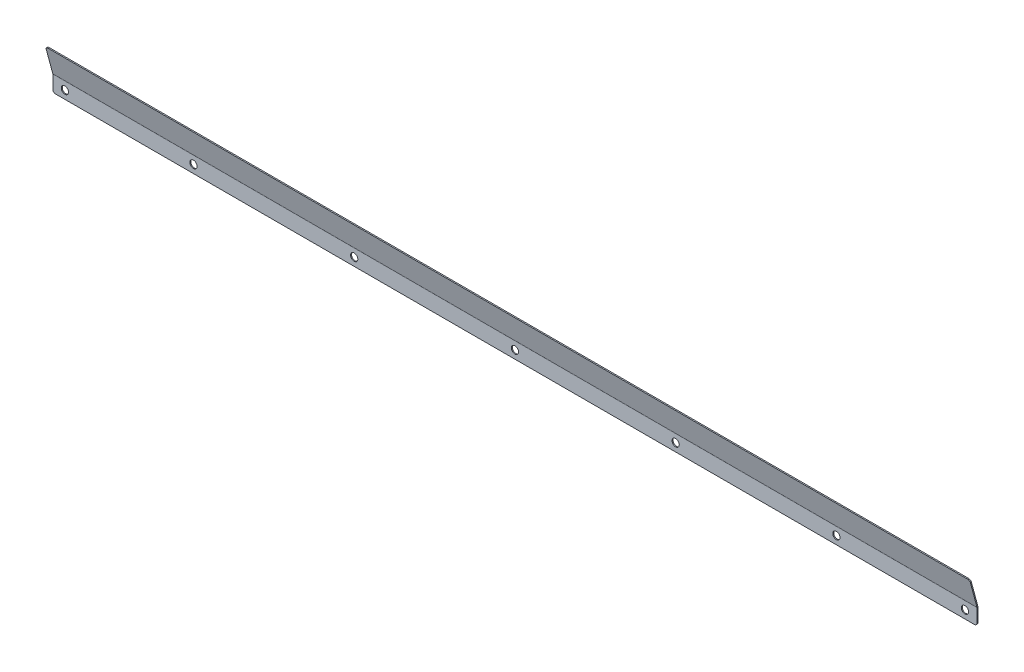
ISO-10303-21;
HEADER;
FILE_DESCRIPTION(('STEP AP214'),'2;1');
FILE_NAME('part.step','',(''),(''),'','','');
FILE_SCHEMA(('AUTOMOTIVE_DESIGN { 1 0 10303 214 1 1 1 1 }'));
ENDSEC;
DATA;
#1=APPLICATION_CONTEXT('core data for automotive mechanical design processes');
#2=APPLICATION_PROTOCOL_DEFINITION('international standard','automotive_design',2000,#1);
#3=PRODUCT_CONTEXT('',#1,'mechanical');
#4=PRODUCT('Part','Part','',(#3));
#5=PRODUCT_RELATED_PRODUCT_CATEGORY('part','',(#4));
#6=PRODUCT_DEFINITION_FORMATION('','',#4);
#7=PRODUCT_DEFINITION_CONTEXT('part definition',#1,'design');
#8=PRODUCT_DEFINITION('design','',#6,#7);
#9=PRODUCT_DEFINITION_SHAPE('','',#8);
#10=(LENGTH_UNIT() NAMED_UNIT(*) SI_UNIT(.MILLI.,.METRE.));
#11=(NAMED_UNIT(*) PLANE_ANGLE_UNIT() SI_UNIT($,.RADIAN.));
#12=(NAMED_UNIT(*) SI_UNIT($,.STERADIAN.) SOLID_ANGLE_UNIT());
#13=UNCERTAINTY_MEASURE_WITH_UNIT(LENGTH_MEASURE(1.E-05),#10,'distance_accuracy_value','');
#14=(GEOMETRIC_REPRESENTATION_CONTEXT(3) GLOBAL_UNCERTAINTY_ASSIGNED_CONTEXT((#13)) GLOBAL_UNIT_ASSIGNED_CONTEXT((#10,
#11,#12)) REPRESENTATION_CONTEXT('',''));
#15=CARTESIAN_POINT('',(0.,0.,0.));
#16=DIRECTION('',(0.,0.,1.));
#17=DIRECTION('',(1.,0.,0.));
#18=AXIS2_PLACEMENT_3D('',#15,#16,#17);
#19=CARTESIAN_POINT('',(0.,0.,0.));
#20=DIRECTION('',(0.,0.,-1.));
#21=DIRECTION('',(-1.,0.,0.));
#22=AXIS2_PLACEMENT_3D('',#19,#20,#21);
#23=PLANE('',#22);
#24=DIRECTION('',(0.,-1.,0.));
#25=VECTOR('',#24,1.);
#26=CARTESIAN_POINT('',(-575.,9.99999999999982,0.));
#27=LINE('',#26,#25);
#28=CARTESIAN_POINT('',(-575.,9.83280132806372,-1.59811400224363E-13));
#29=VERTEX_POINT('',#28);
#30=CARTESIAN_POINT('',(-575.,-8.00000000000006,0.));
#31=VERTEX_POINT('',#30);
#32=EDGE_CURVE('E194',#29,#31,#27,.T.);
#33=ORIENTED_EDGE('',*,*,#32,.T.);
#34=DIRECTION('',(-0.707106781186567,0.707106781186528,0.));
#35=VECTOR('',#34,1.);
#36=CARTESIAN_POINT('',(-575.,-8.00000000000006,0.));
#37=LINE('',#36,#35);
#38=CARTESIAN_POINT('',(-573.,-10.0000000000002,0.));
#39=VERTEX_POINT('',#38);
#40=EDGE_CURVE('E229',#31,#39,#37,.F.);
#41=ORIENTED_EDGE('',*,*,#40,.T.);
#42=DIRECTION('',(1.,0.,0.));
#43=VECTOR('',#42,1.);
#44=CARTESIAN_POINT('',(575.,-9.99999999999982,0.));
#45=LINE('',#44,#43);
#46=CARTESIAN_POINT('',(573.,-9.99999999999982,0.));
#47=VERTEX_POINT('',#46);
#48=EDGE_CURVE('E207',#39,#47,#45,.T.);
#49=ORIENTED_EDGE('',*,*,#48,.T.);
#50=DIRECTION('',(-0.707106781186547,-0.707106781186548,0.));
#51=VECTOR('',#50,1.);
#52=CARTESIAN_POINT('',(573.,-9.99999999999982,0.));
#53=LINE('',#52,#51);
#54=CARTESIAN_POINT('',(575.,-7.99999999999993,0.));
#55=VERTEX_POINT('',#54);
#56=EDGE_CURVE('E227',#47,#55,#53,.F.);
#57=ORIENTED_EDGE('',*,*,#56,.T.);
#58=DIRECTION('',(0.,1.,0.));
#59=VECTOR('',#58,1.);
#60=CARTESIAN_POINT('',(575.,10.0000000000002,0.));
#61=LINE('',#60,#59);
#62=CARTESIAN_POINT('',(575.,9.83280132806372,0.));
#63=VERTEX_POINT('',#62);
#64=EDGE_CURVE('E200',#55,#63,#61,.T.);
#65=ORIENTED_EDGE('',*,*,#64,.T.);
#66=DIRECTION('',(-1.,0.,0.));
#67=VECTOR('',#66,1.);
#68=CARTESIAN_POINT('',(-575.,9.83280132806372,-1.59811400224363E-13));
#69=LINE('',#68,#67);
#70=EDGE_CURVE('E187',#29,#63,#69,.F.);
#71=ORIENTED_EDGE('',*,*,#70,.F.);
#72=EDGE_LOOP('',(#33,#41,#49,#57,#65,#71));
#73=FACE_BOUND('',#72,.T.);
#74=CARTESIAN_POINT('',(-560.,0.,0.));
#75=DIRECTION('',(0.,0.,1.));
#76=DIRECTION('',(1.,0.,0.));
#77=AXIS2_PLACEMENT_3D('',#74,#75,#76);
#78=CIRCLE('',#77,4.49999999999995);
#79=CARTESIAN_POINT('',(-555.5,0.,0.));
#80=VERTEX_POINT('',#79);
#81=EDGE_CURVE('E278',#80,#80,#78,.T.);
#82=ORIENTED_EDGE('',*,*,#81,.F.);
#83=EDGE_LOOP('',(#82));
#84=FACE_BOUND('',#83,.T.);
#85=CARTESIAN_POINT('',(-400.,0.,0.));
#86=DIRECTION('',(0.,0.,1.));
#87=DIRECTION('',(1.,0.,0.));
#88=AXIS2_PLACEMENT_3D('',#85,#86,#87);
#89=CIRCLE('',#88,4.5);
#90=CARTESIAN_POINT('',(-395.5,0.,0.));
#91=VERTEX_POINT('',#90);
#92=EDGE_CURVE('E284',#91,#91,#89,.T.);
#93=ORIENTED_EDGE('',*,*,#92,.F.);
#94=EDGE_LOOP('',(#93));
#95=FACE_BOUND('',#94,.T.);
#96=CARTESIAN_POINT('',(-200.,0.,0.));
#97=DIRECTION('',(0.,0.,1.));
#98=DIRECTION('',(1.,0.,0.));
#99=AXIS2_PLACEMENT_3D('',#96,#97,#98);
#100=CIRCLE('',#99,4.5);
#101=CARTESIAN_POINT('',(-195.5,0.,0.));
#102=VERTEX_POINT('',#101);
#103=EDGE_CURVE('E290',#102,#102,#100,.T.);
#104=ORIENTED_EDGE('',*,*,#103,.F.);
#105=EDGE_LOOP('',(#104));
#106=FACE_BOUND('',#105,.T.);
#107=CARTESIAN_POINT('',(0.,0.,0.));
#108=DIRECTION('',(0.,0.,1.));
#109=DIRECTION('',(1.,0.,0.));
#110=AXIS2_PLACEMENT_3D('',#107,#108,#109);
#111=CIRCLE('',#110,4.5);
#112=CARTESIAN_POINT('',(4.5,0.,0.));
#113=VERTEX_POINT('',#112);
#114=EDGE_CURVE('E296',#113,#113,#111,.T.);
#115=ORIENTED_EDGE('',*,*,#114,.F.);
#116=EDGE_LOOP('',(#115));
#117=FACE_BOUND('',#116,.T.);
#118=CARTESIAN_POINT('',(200.,0.,0.));
#119=DIRECTION('',(0.,0.,1.));
#120=DIRECTION('',(1.,0.,0.));
#121=AXIS2_PLACEMENT_3D('',#118,#119,#120);
#122=CIRCLE('',#121,4.5);
#123=CARTESIAN_POINT('',(204.5,0.,0.));
#124=VERTEX_POINT('',#123);
#125=EDGE_CURVE('E302',#124,#124,#122,.T.);
#126=ORIENTED_EDGE('',*,*,#125,.F.);
#127=EDGE_LOOP('',(#126));
#128=FACE_BOUND('',#127,.T.);
#129=CARTESIAN_POINT('',(400.,0.,0.));
#130=DIRECTION('',(0.,0.,1.));
#131=DIRECTION('',(1.,0.,0.));
#132=AXIS2_PLACEMENT_3D('',#129,#130,#131);
#133=CIRCLE('',#132,4.5);
#134=CARTESIAN_POINT('',(404.5,0.,0.));
#135=VERTEX_POINT('',#134);
#136=EDGE_CURVE('E308',#135,#135,#133,.T.);
#137=ORIENTED_EDGE('',*,*,#136,.F.);
#138=EDGE_LOOP('',(#137));
#139=FACE_BOUND('',#138,.T.);
#140=CARTESIAN_POINT('',(560.,0.,0.));
#141=DIRECTION('',(0.,0.,1.));
#142=DIRECTION('',(1.,0.,0.));
#143=AXIS2_PLACEMENT_3D('',#140,#141,#142);
#144=CIRCLE('',#143,4.49999999999995);
#145=CARTESIAN_POINT('',(564.5,0.,0.));
#146=VERTEX_POINT('',#145);
#147=EDGE_CURVE('E314',#146,#146,#144,.T.);
#148=ORIENTED_EDGE('',*,*,#147,.F.);
#149=EDGE_LOOP('',(#148));
#150=FACE_BOUND('',#149,.T.);
#151=ADVANCED_FACE('F41',(#73,#84,#95,#106,#117,#128,#139,#150),#23,.F.);
#152=CARTESIAN_POINT('',(-575.,9.99999999999982,-1.21412));
#153=DIRECTION('',(-1.,0.,0.));
#154=DIRECTION('',(0.,0.,1.));
#155=AXIS2_PLACEMENT_3D('',#152,#153,#154);
#156=PLANE('',#155);
#157=DIRECTION('',(0.,-1.,0.));
#158=VECTOR('',#157,1.);
#159=CARTESIAN_POINT('',(-575.,9.99999999999982,-1.21412));
#160=LINE('',#159,#158);
#161=CARTESIAN_POINT('',(-575.,9.83280132806356,-1.21412000000016));
#162=VERTEX_POINT('',#161);
#163=CARTESIAN_POINT('',(-575.,-8.00000000000006,-1.21412));
#164=VERTEX_POINT('',#163);
#165=EDGE_CURVE('E196',#162,#164,#160,.T.);
#166=ORIENTED_EDGE('',*,*,#165,.T.);
#167=DIRECTION('',(0.,0.,1.));
#168=VECTOR('',#167,1.);
#169=CARTESIAN_POINT('',(-575.,-8.00000000000006,-1.21412));
#170=LINE('',#169,#168);
#171=EDGE_CURVE('E224',#164,#31,#170,.T.);
#172=ORIENTED_EDGE('',*,*,#171,.T.);
#173=ORIENTED_EDGE('',*,*,#32,.F.);
#174=DIRECTION('',(0.,-1.39324247676828E-13,-1.));
#175=VECTOR('',#174,1.);
#176=CARTESIAN_POINT('',(-575.,9.83280132806372,-1.59811400224363E-13));
#177=LINE('',#176,#175);
#178=EDGE_CURVE('E183',#29,#162,#177,.T.);
#179=ORIENTED_EDGE('',*,*,#178,.T.);
#180=EDGE_LOOP('',(#166,#172,#173,#179));
#181=FACE_BOUND('',#180,.T.);
#182=ADVANCED_FACE('F245',(#181),#156,.T.);
#183=CARTESIAN_POINT('',(0.,0.,-1.21412));
#184=DIRECTION('',(0.,0.,-1.));
#185=DIRECTION('',(-1.,0.,0.));
#186=AXIS2_PLACEMENT_3D('',#183,#184,#185);
#187=PLANE('',#186);
#188=CARTESIAN_POINT('',(560.,0.,-1.21412));
#189=DIRECTION('',(0.,0.,-1.));
#190=DIRECTION('',(-1.,0.,0.));
#191=AXIS2_PLACEMENT_3D('',#188,#189,#190);
#192=CIRCLE('',#191,4.49999999999995);
#193=CARTESIAN_POINT('',(555.5,0.,-1.21412));
#194=VERTEX_POINT('',#193);
#195=EDGE_CURVE('E311',#194,#194,#192,.T.);
#196=ORIENTED_EDGE('',*,*,#195,.F.);
#197=EDGE_LOOP('',(#196));
#198=FACE_BOUND('',#197,.T.);
#199=CARTESIAN_POINT('',(400.,0.,-1.21412));
#200=DIRECTION('',(0.,0.,-1.));
#201=DIRECTION('',(-1.,0.,0.));
#202=AXIS2_PLACEMENT_3D('',#199,#200,#201);
#203=CIRCLE('',#202,4.5);
#204=CARTESIAN_POINT('',(395.5,0.,-1.21412));
#205=VERTEX_POINT('',#204);
#206=EDGE_CURVE('E305',#205,#205,#203,.T.);
#207=ORIENTED_EDGE('',*,*,#206,.F.);
#208=EDGE_LOOP('',(#207));
#209=FACE_BOUND('',#208,.T.);
#210=CARTESIAN_POINT('',(200.,0.,-1.21412));
#211=DIRECTION('',(0.,0.,-1.));
#212=DIRECTION('',(-1.,0.,0.));
#213=AXIS2_PLACEMENT_3D('',#210,#211,#212);
#214=CIRCLE('',#213,4.5);
#215=CARTESIAN_POINT('',(195.5,0.,-1.21412));
#216=VERTEX_POINT('',#215);
#217=EDGE_CURVE('E299',#216,#216,#214,.T.);
#218=ORIENTED_EDGE('',*,*,#217,.F.);
#219=EDGE_LOOP('',(#218));
#220=FACE_BOUND('',#219,.T.);
#221=CARTESIAN_POINT('',(0.,0.,-1.21412));
#222=DIRECTION('',(0.,0.,-1.));
#223=DIRECTION('',(-1.,0.,0.));
#224=AXIS2_PLACEMENT_3D('',#221,#222,#223);
#225=CIRCLE('',#224,4.5);
#226=CARTESIAN_POINT('',(-4.5,0.,-1.21412));
#227=VERTEX_POINT('',#226);
#228=EDGE_CURVE('E293',#227,#227,#225,.T.);
#229=ORIENTED_EDGE('',*,*,#228,.F.);
#230=EDGE_LOOP('',(#229));
#231=FACE_BOUND('',#230,.T.);
#232=CARTESIAN_POINT('',(-200.,0.,-1.21412));
#233=DIRECTION('',(0.,0.,-1.));
#234=DIRECTION('',(-1.,0.,0.));
#235=AXIS2_PLACEMENT_3D('',#232,#233,#234);
#236=CIRCLE('',#235,4.5);
#237=CARTESIAN_POINT('',(-204.5,0.,-1.21412));
#238=VERTEX_POINT('',#237);
#239=EDGE_CURVE('E287',#238,#238,#236,.T.);
#240=ORIENTED_EDGE('',*,*,#239,.F.);
#241=EDGE_LOOP('',(#240));
#242=FACE_BOUND('',#241,.T.);
#243=CARTESIAN_POINT('',(-400.,0.,-1.21412));
#244=DIRECTION('',(0.,0.,-1.));
#245=DIRECTION('',(-1.,0.,0.));
#246=AXIS2_PLACEMENT_3D('',#243,#244,#245);
#247=CIRCLE('',#246,4.5);
#248=CARTESIAN_POINT('',(-404.5,0.,-1.21412));
#249=VERTEX_POINT('',#248);
#250=EDGE_CURVE('E281',#249,#249,#247,.T.);
#251=ORIENTED_EDGE('',*,*,#250,.F.);
#252=EDGE_LOOP('',(#251));
#253=FACE_BOUND('',#252,.T.);
#254=CARTESIAN_POINT('',(-560.,0.,-1.21412));
#255=DIRECTION('',(0.,0.,-1.));
#256=DIRECTION('',(-1.,0.,0.));
#257=AXIS2_PLACEMENT_3D('',#254,#255,#256);
#258=CIRCLE('',#257,4.49999999999995);
#259=CARTESIAN_POINT('',(-564.5,0.,-1.21412));
#260=VERTEX_POINT('',#259);
#261=EDGE_CURVE('E273',#260,#260,#258,.T.);
#262=ORIENTED_EDGE('',*,*,#261,.F.);
#263=EDGE_LOOP('',(#262));
#264=FACE_BOUND('',#263,.T.);
#265=DIRECTION('',(1.,0.,0.));
#266=VECTOR('',#265,1.);
#267=CARTESIAN_POINT('',(575.,-9.99999999999982,-1.21412));
#268=LINE('',#267,#266);
#269=CARTESIAN_POINT('',(-573.,-10.0000000000002,-1.21412));
#270=VERTEX_POINT('',#269);
#271=CARTESIAN_POINT('',(573.,-9.99999999999982,-1.21412));
#272=VERTEX_POINT('',#271);
#273=EDGE_CURVE('E199',#270,#272,#268,.T.);
#274=ORIENTED_EDGE('',*,*,#273,.F.);
#275=DIRECTION('',(0.707106781186567,-0.707106781186528,0.));
#276=VECTOR('',#275,1.);
#277=CARTESIAN_POINT('',(-291.499999999985,-291.5,-1.21412));
#278=LINE('',#277,#276);
#279=EDGE_CURVE('E237',#270,#164,#278,.F.);
#280=ORIENTED_EDGE('',*,*,#279,.T.);
#281=ORIENTED_EDGE('',*,*,#165,.F.);
#282=DIRECTION('',(-1.,0.,0.));
#283=VECTOR('',#282,1.);
#284=CARTESIAN_POINT('',(-575.,9.83280132806355,-1.21412000000016));
#285=LINE('',#284,#283);
#286=CARTESIAN_POINT('',(575.,9.83280132806372,-1.21412));
#287=VERTEX_POINT('',#286);
#288=EDGE_CURVE('E140',#162,#287,#285,.F.);
#289=ORIENTED_EDGE('',*,*,#288,.T.);
#290=DIRECTION('',(0.,1.,0.));
#291=VECTOR('',#290,1.);
#292=CARTESIAN_POINT('',(575.,10.0000000000002,-1.21412));
#293=LINE('',#292,#291);
#294=CARTESIAN_POINT('',(575.,-7.99999999999993,-1.21412));
#295=VERTEX_POINT('',#294);
#296=EDGE_CURVE('E202',#295,#287,#293,.T.);
#297=ORIENTED_EDGE('',*,*,#296,.F.);
#298=DIRECTION('',(0.707106781186547,0.707106781186548,0.));
#299=VECTOR('',#298,1.);
#300=CARTESIAN_POINT('',(291.5,-291.5,-1.21412));
#301=LINE('',#300,#299);
#302=EDGE_CURVE('E63',#295,#272,#301,.F.);
#303=ORIENTED_EDGE('',*,*,#302,.T.);
#304=EDGE_LOOP('',(#274,#280,#281,#289,#297,#303));
#305=FACE_BOUND('',#304,.T.);
#306=ADVANCED_FACE('F240',(#198,#209,#220,#231,#242,#253,#264,#305),#187,.T.);
#307=CARTESIAN_POINT('',(575.,10.0000000000002,-1.21412));
#308=DIRECTION('',(1.,0.,0.));
#309=DIRECTION('',(0.,0.,-1.));
#310=AXIS2_PLACEMENT_3D('',#307,#308,#309);
#311=PLANE('',#310);
#312=ORIENTED_EDGE('',*,*,#64,.F.);
#313=DIRECTION('',(0.,0.,-1.));
#314=VECTOR('',#313,1.);
#315=CARTESIAN_POINT('',(575.,-7.99999999999993,-1.21412));
#316=LINE('',#315,#314);
#317=EDGE_CURVE('E50',#55,#295,#316,.T.);
#318=ORIENTED_EDGE('',*,*,#317,.T.);
#319=ORIENTED_EDGE('',*,*,#296,.T.);
#320=DIRECTION('',(0.,-1.39324247676828E-13,-1.));
#321=VECTOR('',#320,1.);
#322=CARTESIAN_POINT('',(575.,9.83280132806372,0.));
#323=LINE('',#322,#321);
#324=EDGE_CURVE('E191',#63,#287,#323,.T.);
#325=ORIENTED_EDGE('',*,*,#324,.F.);
#326=EDGE_LOOP('',(#312,#318,#319,#325));
#327=FACE_BOUND('',#326,.T.);
#328=ADVANCED_FACE('F258',(#327),#311,.T.);
#329=CARTESIAN_POINT('',(575.,-9.99999999999982,-1.21412));
#330=DIRECTION('',(0.,-1.,0.));
#331=DIRECTION('',(1.,0.,0.));
#332=AXIS2_PLACEMENT_3D('',#329,#330,#331);
#333=PLANE('',#332);
#334=ORIENTED_EDGE('',*,*,#48,.F.);
#335=DIRECTION('',(0.,0.,-1.));
#336=VECTOR('',#335,1.);
#337=CARTESIAN_POINT('',(-573.,-10.0000000000002,-1.21412));
#338=LINE('',#337,#336);
#339=EDGE_CURVE('E234',#39,#270,#338,.T.);
#340=ORIENTED_EDGE('',*,*,#339,.T.);
#341=ORIENTED_EDGE('',*,*,#273,.T.);
#342=DIRECTION('',(0.,0.,1.));
#343=VECTOR('',#342,1.);
#344=CARTESIAN_POINT('',(573.,-9.99999999999982,-1.21412));
#345=LINE('',#344,#343);
#346=EDGE_CURVE('E231',#272,#47,#345,.T.);
#347=ORIENTED_EDGE('',*,*,#346,.T.);
#348=EDGE_LOOP('',(#334,#340,#341,#347));
#349=FACE_BOUND('',#348,.T.);
#350=ADVANCED_FACE('F253',(#349),#333,.T.);
#351=CARTESIAN_POINT('',(575.,9.8328013280639,1.27000000000039));
#352=DIRECTION('',(1.,0.,0.));
#353=DIRECTION('',(0.,0.,-1.));
#354=AXIS2_PLACEMENT_3D('',#351,#352,#353);
#355=PLANE('',#354);
#356=DIRECTION('',(0.,0.258819045102515,-0.96592582628907));
#357=VECTOR('',#356,1.);
#358=CARTESIAN_POINT('',(575.,10.1615015153444,0.0432742006128812));
#359=LINE('',#358,#357);
#360=CARTESIAN_POINT('',(575.,10.1615015153442,0.0432742006128348));
#361=VERTEX_POINT('',#360);
#362=CARTESIAN_POINT('',(575.,10.4757388943841,-1.12947566360125));
#363=VERTEX_POINT('',#362);
#364=EDGE_CURVE('E264',#361,#363,#359,.T.);
#365=ORIENTED_EDGE('',*,*,#364,.F.);
#366=CARTESIAN_POINT('',(575.,9.8328013280639,1.27000000000039));
#367=DIRECTION('',(-1.,0.,0.));
#368=DIRECTION('',(0.,0.,1.));
#369=AXIS2_PLACEMENT_3D('',#366,#367,#368);
#370=CIRCLE('',#369,1.27000000000045);
#371=EDGE_CURVE('E143',#63,#361,#370,.F.);
#372=ORIENTED_EDGE('',*,*,#371,.F.);
#373=ORIENTED_EDGE('',*,*,#324,.T.);
#374=CARTESIAN_POINT('',(575.,9.8328013280639,1.27000000000039));
#375=DIRECTION('',(-1.,0.,0.));
#376=DIRECTION('',(0.,0.,1.));
#377=AXIS2_PLACEMENT_3D('',#374,#375,#376);
#378=CIRCLE('',#377,2.48412000000045);
#379=EDGE_CURVE('E182',#287,#363,#378,.F.);
#380=ORIENTED_EDGE('',*,*,#379,.T.);
#381=EDGE_LOOP('',(#365,#372,#373,#380));
#382=FACE_BOUND('',#381,.T.);
#383=ADVANCED_FACE('F262',(#382),#355,.T.);
#384=CARTESIAN_POINT('',(-575.,9.8328013280639,1.27000000000029));
#385=DIRECTION('',(1.,0.,0.));
#386=DIRECTION('',(0.,0.,-1.));
#387=AXIS2_PLACEMENT_3D('',#384,#385,#386);
#388=PLANE('',#387);
#389=CARTESIAN_POINT('',(-575.,9.8328013280639,1.27000000000029));
#390=DIRECTION('',(-1.,0.,0.));
#391=DIRECTION('',(0.,0.,1.));
#392=AXIS2_PLACEMENT_3D('',#389,#390,#391);
#393=CIRCLE('',#392,1.27000000000045);
#394=CARTESIAN_POINT('',(-575.,10.1615015153442,0.0432742006127368));
#395=VERTEX_POINT('',#394);
#396=EDGE_CURVE('E150',#395,#29,#393,.T.);
#397=ORIENTED_EDGE('',*,*,#396,.F.);
#398=DIRECTION('',(0.,0.258819045102515,-0.96592582628907));
#399=VECTOR('',#398,1.);
#400=CARTESIAN_POINT('',(-575.,10.161501515344,0.0432742006128721));
#401=LINE('',#400,#399);
#402=CARTESIAN_POINT('',(-575.,10.4757388943839,-1.12947566360126));
#403=VERTEX_POINT('',#402);
#404=EDGE_CURVE('E147',#395,#403,#401,.T.);
#405=ORIENTED_EDGE('',*,*,#404,.T.);
#406=CARTESIAN_POINT('',(-575.,9.8328013280639,1.27000000000029));
#407=DIRECTION('',(-1.,0.,0.));
#408=DIRECTION('',(0.,0.,1.));
#409=AXIS2_PLACEMENT_3D('',#406,#407,#408);
#410=CIRCLE('',#409,2.48412000000045);
#411=EDGE_CURVE('E132',#403,#162,#410,.T.);
#412=ORIENTED_EDGE('',*,*,#411,.T.);
#413=ORIENTED_EDGE('',*,*,#178,.F.);
#414=EDGE_LOOP('',(#397,#405,#412,#413));
#415=FACE_BOUND('',#414,.T.);
#416=ADVANCED_FACE('F148',(#415),#388,.F.);
#417=CARTESIAN_POINT('',(-575.,9.8328013280639,1.27000000000029));
#418=DIRECTION('',(-1.,0.,0.));
#419=DIRECTION('',(0.,0.258819045102515,-0.96592582628907));
#420=AXIS2_PLACEMENT_3D('',#417,#418,#419);
#421=CYLINDRICAL_SURFACE('',#420,2.48412000000045);
#422=ORIENTED_EDGE('',*,*,#288,.F.);
#423=ORIENTED_EDGE('',*,*,#411,.F.);
#424=DIRECTION('',(1.,0.,0.));
#425=VECTOR('',#424,1.);
#426=CARTESIAN_POINT('',(0.,10.4757388943841,-1.12947566360121));
#427=LINE('',#426,#425);
#428=EDGE_CURVE('E137',#403,#363,#427,.T.);
#429=ORIENTED_EDGE('',*,*,#428,.T.);
#430=ORIENTED_EDGE('',*,*,#379,.F.);
#431=EDGE_LOOP('',(#422,#423,#429,#430));
#432=FACE_BOUND('',#431,.T.);
#433=ADVANCED_FACE('F134',(#432),#421,.T.);
#434=CARTESIAN_POINT('',(-575.,9.8328013280639,1.27000000000029));
#435=DIRECTION('',(-1.,0.,0.));
#436=DIRECTION('',(0.,0.258819045102515,-0.96592582628907));
#437=AXIS2_PLACEMENT_3D('',#434,#435,#436);
#438=CYLINDRICAL_SURFACE('',#437,1.27000000000045);
#439=ORIENTED_EDGE('',*,*,#70,.T.);
#440=ORIENTED_EDGE('',*,*,#371,.T.);
#441=DIRECTION('',(-1.,0.,0.));
#442=VECTOR('',#441,1.);
#443=CARTESIAN_POINT('',(575.,10.1615015153444,0.0432742006128812));
#444=LINE('',#443,#442);
#445=EDGE_CURVE('E155',#361,#395,#444,.T.);
#446=ORIENTED_EDGE('',*,*,#445,.T.);
#447=ORIENTED_EDGE('',*,*,#396,.T.);
#448=EDGE_LOOP('',(#439,#440,#446,#447));
#449=FACE_BOUND('',#448,.T.);
#450=ADVANCED_FACE('F267',(#449),#438,.F.);
#451=CARTESIAN_POINT('',(575.,10.31423737904,-1.17274986421409));
#452=DIRECTION('',(-1.,0.,0.));
#453=DIRECTION('',(0.,0.,1.));
#454=AXIS2_PLACEMENT_3D('',#451,#452,#453);
#455=PLANE('',#454);
#456=DIRECTION('',(0.,-0.96592582628907,-0.258819045102515));
#457=VECTOR('',#456,1.);
#458=CARTESIAN_POINT('',(575.,10.31423737904,-1.17274986421409));
#459=LINE('',#458,#457);
#460=CARTESIAN_POINT('',(575.,42.0353941979102,7.32690848838295));
#461=VERTEX_POINT('',#460);
#462=EDGE_CURVE('E163',#461,#363,#459,.T.);
#463=ORIENTED_EDGE('',*,*,#462,.F.);
#464=DIRECTION('',(0.,-0.258819045102515,0.96592582628907));
#465=VECTOR('',#464,1.);
#466=CARTESIAN_POINT('',(575.,42.0353941979102,7.32690848838295));
#467=LINE('',#466,#465);
#468=CARTESIAN_POINT('',(575.,41.7211568188703,8.49965835259704));
#469=VERTEX_POINT('',#468);
#470=EDGE_CURVE('E11',#461,#469,#467,.T.);
#471=ORIENTED_EDGE('',*,*,#470,.T.);
#472=DIRECTION('',(0.,-0.96592582628907,-0.258819045102515));
#473=VECTOR('',#472,1.);
#474=CARTESIAN_POINT('',(575.,10.0000000000002,0.));
#475=LINE('',#474,#473);
#476=EDGE_CURVE('E164',#469,#361,#475,.T.);
#477=ORIENTED_EDGE('',*,*,#476,.T.);
#478=ORIENTED_EDGE('',*,*,#364,.T.);
#479=EDGE_LOOP('',(#463,#471,#477,#478));
#480=FACE_BOUND('',#479,.T.);
#481=ADVANCED_FACE('F360',(#480),#455,.F.);
#482=CARTESIAN_POINT('',(-575.,43.9672458504881,7.84454657858801));
#483=DIRECTION('',(1.,0.,0.));
#484=DIRECTION('',(0.,1.,0.));
#485=AXIS2_PLACEMENT_3D('',#482,#483,#484);
#486=PLANE('',#485);
#487=DIRECTION('',(0.,0.96592582628907,0.258819045102515));
#488=VECTOR('',#487,1.);
#489=CARTESIAN_POINT('',(-575.,43.6530084714482,9.0172964428021));
#490=LINE('',#489,#488);
#491=CARTESIAN_POINT('',(-575.,41.7211568188702,8.4996583525971));
#492=VERTEX_POINT('',#491);
#493=EDGE_CURVE('E177',#395,#492,#490,.T.);
#494=ORIENTED_EDGE('',*,*,#493,.T.);
#495=DIRECTION('',(0.,0.258819045102515,-0.96592582628907));
#496=VECTOR('',#495,1.);
#497=CARTESIAN_POINT('',(-575.,42.03539419791,7.32690848838301));
#498=LINE('',#497,#496);
#499=CARTESIAN_POINT('',(-575.,42.03539419791,7.32690848838301));
#500=VERTEX_POINT('',#499);
#501=EDGE_CURVE('E168',#492,#500,#498,.T.);
#502=ORIENTED_EDGE('',*,*,#501,.T.);
#503=DIRECTION('',(0.,0.96592582628907,0.258819045102515));
#504=VECTOR('',#503,1.);
#505=CARTESIAN_POINT('',(-575.,43.9672458504881,7.84454657858801));
#506=LINE('',#505,#504);
#507=EDGE_CURVE('E160',#403,#500,#506,.T.);
#508=ORIENTED_EDGE('',*,*,#507,.F.);
#509=ORIENTED_EDGE('',*,*,#404,.F.);
#510=EDGE_LOOP('',(#494,#502,#508,#509));
#511=FACE_BOUND('',#510,.T.);
#512=ADVANCED_FACE('F166',(#511),#486,.F.);
#513=CARTESIAN_POINT('',(0.,0.98411036011764,-3.67274986421403));
#514=DIRECTION('',(0.,-0.258819045102515,0.96592582628907));
#515=DIRECTION('',(0.,-0.96592582628907,-0.258819045102515));
#516=AXIS2_PLACEMENT_3D('',#513,#514,#515);
#517=PLANE('',#516);
#518=ORIENTED_EDGE('',*,*,#507,.T.);
#519=DIRECTION('',(-0.707106781186547,-0.683012701892221,-0.183012701892215));
#520=VECTOR('',#519,1.);
#521=CARTESIAN_POINT('',(-573.,43.9672458504881,7.84454657858801));
#522=LINE('',#521,#520);
#523=CARTESIAN_POINT('',(-573.,43.9672458504881,7.84454657858801));
#524=VERTEX_POINT('',#523);
#525=EDGE_CURVE('E222',#500,#524,#522,.F.);
#526=ORIENTED_EDGE('',*,*,#525,.T.);
#527=DIRECTION('',(1.,0.,0.));
#528=VECTOR('',#527,1.);
#529=CARTESIAN_POINT('',(575.,43.9672458504884,7.84454657858801));
#530=LINE('',#529,#528);
#531=CARTESIAN_POINT('',(573.,43.9672458504884,7.84454657858801));
#532=VERTEX_POINT('',#531);
#533=EDGE_CURVE('E169',#524,#532,#530,.T.);
#534=ORIENTED_EDGE('',*,*,#533,.T.);
#535=DIRECTION('',(-0.707106781186547,0.683012701892221,0.183012701892215));
#536=VECTOR('',#535,1.);
#537=CARTESIAN_POINT('',(575.,42.0353941979102,7.32690848838295));
#538=LINE('',#537,#536);
#539=EDGE_CURVE('E220',#532,#461,#538,.F.);
#540=ORIENTED_EDGE('',*,*,#539,.T.);
#541=ORIENTED_EDGE('',*,*,#462,.T.);
#542=ORIENTED_EDGE('',*,*,#428,.F.);
#543=EDGE_LOOP('',(#518,#526,#534,#540,#541,#542));
#544=FACE_BOUND('',#543,.T.);
#545=ADVANCED_FACE('F159',(#544),#517,.F.);
#546=CARTESIAN_POINT('',(0.,0.669872981077775,-2.49999999999994));
#547=DIRECTION('',(0.,-0.258819045102515,0.96592582628907));
#548=DIRECTION('',(0.,-0.96592582628907,-0.258819045102515));
#549=AXIS2_PLACEMENT_3D('',#546,#547,#548);
#550=PLANE('',#549);
#551=DIRECTION('',(1.,0.,0.));
#552=VECTOR('',#551,1.);
#553=CARTESIAN_POINT('',(575.,43.6530084714486,9.0172964428021));
#554=LINE('',#553,#552);
#555=CARTESIAN_POINT('',(-573.,43.6530084714482,9.0172964428021));
#556=VERTEX_POINT('',#555);
#557=CARTESIAN_POINT('',(573.,43.6530084714486,9.0172964428021));
#558=VERTEX_POINT('',#557);
#559=EDGE_CURVE('E173',#556,#558,#554,.T.);
#560=ORIENTED_EDGE('',*,*,#559,.F.);
#561=DIRECTION('',(0.707106781186547,0.683012701892221,0.183012701892215));
#562=VECTOR('',#561,1.);
#563=CARTESIAN_POINT('',(-308.749708166261,298.899189958082,77.4103046432715));
#564=LINE('',#563,#562);
#565=EDGE_CURVE('E217',#556,#492,#564,.F.);
#566=ORIENTED_EDGE('',*,*,#565,.T.);
#567=ORIENTED_EDGE('',*,*,#493,.F.);
#568=ORIENTED_EDGE('',*,*,#445,.F.);
#569=ORIENTED_EDGE('',*,*,#476,.F.);
#570=DIRECTION('',(0.707106781186547,-0.683012701892221,-0.183012701892215));
#571=VECTOR('',#570,1.);
#572=CARTESIAN_POINT('',(308.749708166261,298.899189958082,77.4103046432714));
#573=LINE('',#572,#571);
#574=EDGE_CURVE('E215',#469,#558,#573,.F.);
#575=ORIENTED_EDGE('',*,*,#574,.T.);
#576=EDGE_LOOP('',(#560,#566,#567,#568,#569,#575));
#577=FACE_BOUND('',#576,.T.);
#578=ADVANCED_FACE('F271',(#577),#550,.T.);
#579=CARTESIAN_POINT('',(575.,43.9672458504884,7.84454657858801));
#580=DIRECTION('',(0.,-0.96592582628907,-0.258819045102515));
#581=DIRECTION('',(0.,0.258819045102515,-0.96592582628907));
#582=AXIS2_PLACEMENT_3D('',#579,#580,#581);
#583=PLANE('',#582);
#584=ORIENTED_EDGE('',*,*,#533,.F.);
#585=DIRECTION('',(0.,-0.258819045102515,0.96592582628907));
#586=VECTOR('',#585,1.);
#587=CARTESIAN_POINT('',(-573.,43.9672458504881,7.84454657858801));
#588=LINE('',#587,#586);
#589=EDGE_CURVE('E212',#524,#556,#588,.T.);
#590=ORIENTED_EDGE('',*,*,#589,.T.);
#591=ORIENTED_EDGE('',*,*,#559,.T.);
#592=DIRECTION('',(0.,0.258819045102515,-0.96592582628907));
#593=VECTOR('',#592,1.);
#594=CARTESIAN_POINT('',(573.,43.9672458504884,7.84454657858801));
#595=LINE('',#594,#593);
#596=EDGE_CURVE('E204',#558,#532,#595,.T.);
#597=ORIENTED_EDGE('',*,*,#596,.T.);
#598=EDGE_LOOP('',(#584,#590,#591,#597));
#599=FACE_BOUND('',#598,.T.);
#600=ADVANCED_FACE('F400',(#599),#583,.F.);
#601=CARTESIAN_POINT('',(-560.,0.,0.));
#602=DIRECTION('',(0.,0.,1.));
#603=DIRECTION('',(1.,0.,0.));
#604=AXIS2_PLACEMENT_3D('',#601,#602,#603);
#605=CYLINDRICAL_SURFACE('',#604,4.49999999999995);
#606=ORIENTED_EDGE('',*,*,#81,.T.);
#607=EDGE_LOOP('',(#606));
#608=FACE_BOUND('',#607,.T.);
#609=ORIENTED_EDGE('',*,*,#261,.T.);
#610=EDGE_LOOP('',(#609));
#611=FACE_BOUND('',#610,.T.);
#612=ADVANCED_FACE('F394',(#608,#611),#605,.F.);
#613=CARTESIAN_POINT('',(-400.,0.,0.));
#614=DIRECTION('',(0.,0.,1.));
#615=DIRECTION('',(1.,0.,0.));
#616=AXIS2_PLACEMENT_3D('',#613,#614,#615);
#617=CYLINDRICAL_SURFACE('',#616,4.5);
#618=ORIENTED_EDGE('',*,*,#92,.T.);
#619=EDGE_LOOP('',(#618));
#620=FACE_BOUND('',#619,.T.);
#621=ORIENTED_EDGE('',*,*,#250,.T.);
#622=EDGE_LOOP('',(#621));
#623=FACE_BOUND('',#622,.T.);
#624=ADVANCED_FACE('F399',(#620,#623),#617,.F.);
#625=CARTESIAN_POINT('',(-200.,0.,0.));
#626=DIRECTION('',(0.,0.,1.));
#627=DIRECTION('',(1.,0.,0.));
#628=AXIS2_PLACEMENT_3D('',#625,#626,#627);
#629=CYLINDRICAL_SURFACE('',#628,4.5);
#630=ORIENTED_EDGE('',*,*,#103,.T.);
#631=EDGE_LOOP('',(#630));
#632=FACE_BOUND('',#631,.T.);
#633=ORIENTED_EDGE('',*,*,#239,.T.);
#634=EDGE_LOOP('',(#633));
#635=FACE_BOUND('',#634,.T.);
#636=ADVANCED_FACE('F412',(#632,#635),#629,.F.);
#637=CARTESIAN_POINT('',(0.,0.,0.));
#638=DIRECTION('',(0.,0.,1.));
#639=DIRECTION('',(1.,0.,0.));
#640=AXIS2_PLACEMENT_3D('',#637,#638,#639);
#641=CYLINDRICAL_SURFACE('',#640,4.5);
#642=ORIENTED_EDGE('',*,*,#114,.T.);
#643=EDGE_LOOP('',(#642));
#644=FACE_BOUND('',#643,.T.);
#645=ORIENTED_EDGE('',*,*,#228,.T.);
#646=EDGE_LOOP('',(#645));
#647=FACE_BOUND('',#646,.T.);
#648=ADVANCED_FACE('F422',(#644,#647),#641,.F.);
#649=CARTESIAN_POINT('',(200.,0.,0.));
#650=DIRECTION('',(0.,0.,1.));
#651=DIRECTION('',(1.,0.,0.));
#652=AXIS2_PLACEMENT_3D('',#649,#650,#651);
#653=CYLINDRICAL_SURFACE('',#652,4.5);
#654=ORIENTED_EDGE('',*,*,#125,.T.);
#655=EDGE_LOOP('',(#654));
#656=FACE_BOUND('',#655,.T.);
#657=ORIENTED_EDGE('',*,*,#217,.T.);
#658=EDGE_LOOP('',(#657));
#659=FACE_BOUND('',#658,.T.);
#660=ADVANCED_FACE('F432',(#656,#659),#653,.F.);
#661=CARTESIAN_POINT('',(400.,0.,0.));
#662=DIRECTION('',(0.,0.,1.));
#663=DIRECTION('',(1.,0.,0.));
#664=AXIS2_PLACEMENT_3D('',#661,#662,#663);
#665=CYLINDRICAL_SURFACE('',#664,4.5);
#666=ORIENTED_EDGE('',*,*,#136,.T.);
#667=EDGE_LOOP('',(#666));
#668=FACE_BOUND('',#667,.T.);
#669=ORIENTED_EDGE('',*,*,#206,.T.);
#670=EDGE_LOOP('',(#669));
#671=FACE_BOUND('',#670,.T.);
#672=ADVANCED_FACE('F442',(#668,#671),#665,.F.);
#673=CARTESIAN_POINT('',(560.,0.,0.));
#674=DIRECTION('',(0.,0.,1.));
#675=DIRECTION('',(1.,0.,0.));
#676=AXIS2_PLACEMENT_3D('',#673,#674,#675);
#677=CYLINDRICAL_SURFACE('',#676,4.49999999999995);
#678=ORIENTED_EDGE('',*,*,#147,.T.);
#679=EDGE_LOOP('',(#678));
#680=FACE_BOUND('',#679,.T.);
#681=ORIENTED_EDGE('',*,*,#195,.T.);
#682=EDGE_LOOP('',(#681));
#683=FACE_BOUND('',#682,.T.);
#684=ADVANCED_FACE('F318',(#680,#683),#677,.F.);
#685=CARTESIAN_POINT('',(-573.,43.9672458504881,7.84454657858801));
#686=DIRECTION('',(0.707106781186548,-0.68301270189222,-0.183012701892215));
#687=DIRECTION('',(0.,-0.258819045102515,0.96592582628907));
#688=AXIS2_PLACEMENT_3D('',#685,#686,#687);
#689=PLANE('',#688);
#690=ORIENTED_EDGE('',*,*,#525,.F.);
#691=ORIENTED_EDGE('',*,*,#501,.F.);
#692=ORIENTED_EDGE('',*,*,#565,.F.);
#693=ORIENTED_EDGE('',*,*,#589,.F.);
#694=EDGE_LOOP('',(#690,#691,#692,#693));
#695=FACE_BOUND('',#694,.T.);
#696=ADVANCED_FACE('F335',(#695),#689,.F.);
#697=CARTESIAN_POINT('',(-575.,-8.00000000000006,-1.21412));
#698=DIRECTION('',(0.707106781186529,0.707106781186567,0.));
#699=DIRECTION('',(0.,0.,1.));
#700=AXIS2_PLACEMENT_3D('',#697,#698,#699);
#701=PLANE('',#700);
#702=ORIENTED_EDGE('',*,*,#279,.F.);
#703=ORIENTED_EDGE('',*,*,#339,.F.);
#704=ORIENTED_EDGE('',*,*,#40,.F.);
#705=ORIENTED_EDGE('',*,*,#171,.F.);
#706=EDGE_LOOP('',(#702,#703,#704,#705));
#707=FACE_BOUND('',#706,.T.);
#708=ADVANCED_FACE('F247',(#707),#701,.F.);
#709=CARTESIAN_POINT('',(573.,-9.99999999999982,-1.21412));
#710=DIRECTION('',(-0.707106781186548,0.707106781186547,0.));
#711=DIRECTION('',(0.,0.,1.));
#712=AXIS2_PLACEMENT_3D('',#709,#710,#711);
#713=PLANE('',#712);
#714=ORIENTED_EDGE('',*,*,#302,.F.);
#715=ORIENTED_EDGE('',*,*,#317,.F.);
#716=ORIENTED_EDGE('',*,*,#56,.F.);
#717=ORIENTED_EDGE('',*,*,#346,.F.);
#718=EDGE_LOOP('',(#714,#715,#716,#717));
#719=FACE_BOUND('',#718,.T.);
#720=ADVANCED_FACE('F256',(#719),#713,.F.);
#721=CARTESIAN_POINT('',(575.,42.0353941979102,7.32690848838295));
#722=DIRECTION('',(-0.707106781186548,-0.68301270189222,-0.183012701892215));
#723=DIRECTION('',(0.,-0.258819045102515,0.96592582628907));
#724=AXIS2_PLACEMENT_3D('',#721,#722,#723);
#725=PLANE('',#724);
#726=ORIENTED_EDGE('',*,*,#539,.F.);
#727=ORIENTED_EDGE('',*,*,#596,.F.);
#728=ORIENTED_EDGE('',*,*,#574,.F.);
#729=ORIENTED_EDGE('',*,*,#470,.F.);
#730=EDGE_LOOP('',(#726,#727,#728,#729));
#731=FACE_BOUND('',#730,.T.);
#732=ADVANCED_FACE('F44',(#731),#725,.F.);
#733=CLOSED_SHELL('',(#151,#182,#306,#328,#350,#383,#416,#433,#450,#481,#512,#545,#578,#600,
#612,#624,#636,#648,#660,#672,#684,#696,#708,#720,#732));
#734=MANIFOLD_SOLID_BREP('B2',#733);
#735=ADVANCED_BREP_SHAPE_REPRESENTATION('',(#18,#734),#14);
#736=SHAPE_DEFINITION_REPRESENTATION(#9,#735);
ENDSEC;
END-ISO-10303-21;
